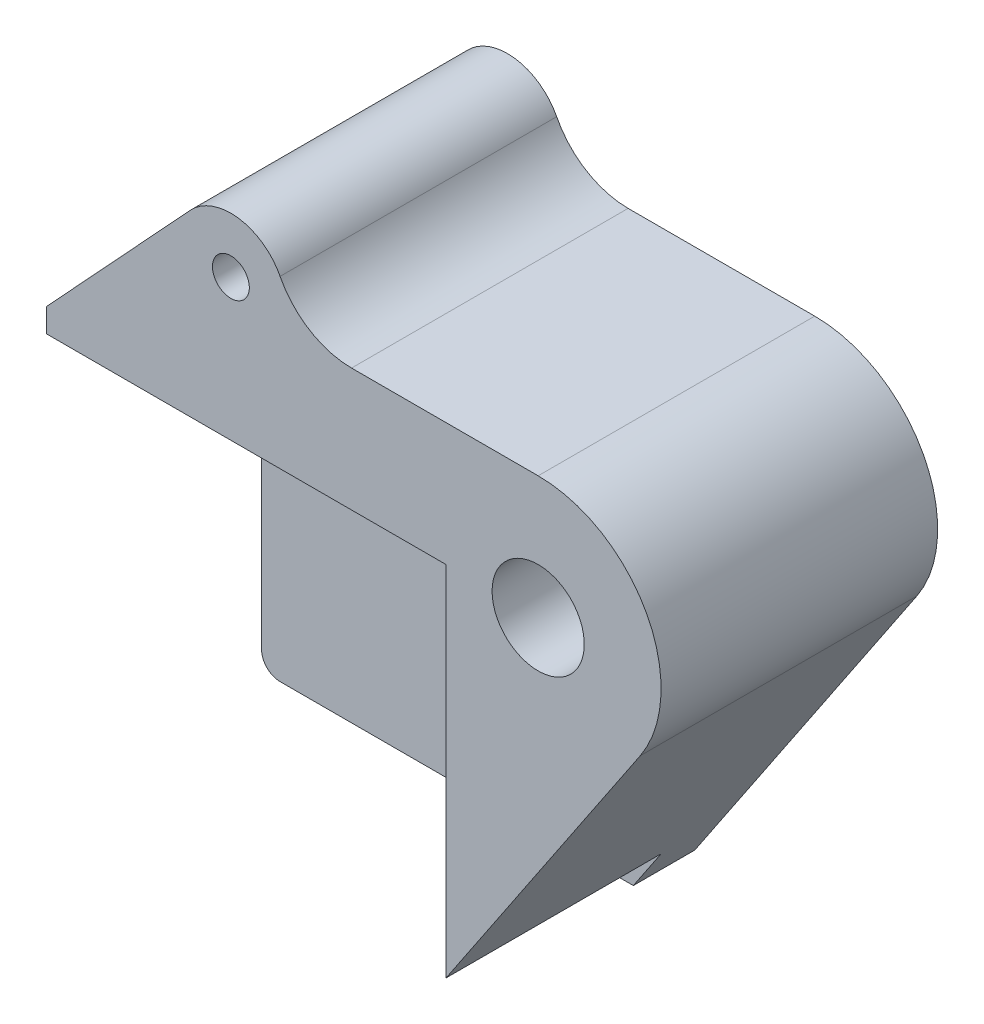
ISO-10303-21;
HEADER;
FILE_DESCRIPTION(('STEP AP214'),'2;1');
FILE_NAME('part.step','',(''),(''),'','','');
FILE_SCHEMA(('AUTOMOTIVE_DESIGN { 1 0 10303 214 1 1 1 1 }'));
ENDSEC;
DATA;
#1=APPLICATION_CONTEXT('core data for automotive mechanical design processes');
#2=APPLICATION_PROTOCOL_DEFINITION('international standard','automotive_design',2000,#1);
#3=PRODUCT_CONTEXT('',#1,'mechanical');
#4=PRODUCT('Part','Part','',(#3));
#5=PRODUCT_RELATED_PRODUCT_CATEGORY('part','',(#4));
#6=PRODUCT_DEFINITION_FORMATION('','',#4);
#7=PRODUCT_DEFINITION_CONTEXT('part definition',#1,'design');
#8=PRODUCT_DEFINITION('design','',#6,#7);
#9=PRODUCT_DEFINITION_SHAPE('','',#8);
#10=(LENGTH_UNIT() NAMED_UNIT(*) SI_UNIT(.MILLI.,.METRE.));
#11=(NAMED_UNIT(*) PLANE_ANGLE_UNIT() SI_UNIT($,.RADIAN.));
#12=(NAMED_UNIT(*) SI_UNIT($,.STERADIAN.) SOLID_ANGLE_UNIT());
#13=UNCERTAINTY_MEASURE_WITH_UNIT(LENGTH_MEASURE(1.E-05),#10,'distance_accuracy_value','');
#14=(GEOMETRIC_REPRESENTATION_CONTEXT(3) GLOBAL_UNCERTAINTY_ASSIGNED_CONTEXT((#13)) GLOBAL_UNIT_ASSIGNED_CONTEXT((#10,
#11,#12)) REPRESENTATION_CONTEXT('',''));
#15=CARTESIAN_POINT('',(0.,0.,0.));
#16=DIRECTION('',(0.,0.,1.));
#17=DIRECTION('',(1.,0.,0.));
#18=AXIS2_PLACEMENT_3D('',#15,#16,#17);
#19=CARTESIAN_POINT('',(0.,0.,45.));
#20=DIRECTION('',(0.,1.,0.));
#21=DIRECTION('',(0.,0.,1.));
#22=AXIS2_PLACEMENT_3D('',#19,#20,#21);
#23=PLANE('',#22);
#24=DIRECTION('',(1.,0.,0.));
#25=VECTOR('',#24,1.);
#26=CARTESIAN_POINT('',(0.,0.,9.99999999999999));
#27=LINE('',#26,#25);
#28=CARTESIAN_POINT('',(3.,0.,9.99999999999999));
#29=VERTEX_POINT('',#28);
#30=CARTESIAN_POINT('',(60.482195672722,0.,9.99999999999999));
#31=VERTEX_POINT('',#30);
#32=EDGE_CURVE('E135',#29,#31,#27,.T.);
#33=ORIENTED_EDGE('',*,*,#32,.F.);
#34=DIRECTION('',(0.,0.,-1.));
#35=VECTOR('',#34,1.);
#36=CARTESIAN_POINT('',(3.,0.,45.));
#37=LINE('',#36,#35);
#38=CARTESIAN_POINT('',(3.,0.,0.));
#39=VERTEX_POINT('',#38);
#40=EDGE_CURVE('E224',#29,#39,#37,.T.);
#41=ORIENTED_EDGE('',*,*,#40,.T.);
#42=DIRECTION('',(1.,0.,0.));
#43=VECTOR('',#42,1.);
#44=CARTESIAN_POINT('',(0.,0.,0.));
#45=LINE('',#44,#43);
#46=CARTESIAN_POINT('',(60.482195672722,0.,0.));
#47=VERTEX_POINT('',#46);
#48=EDGE_CURVE('E173',#39,#47,#45,.T.);
#49=ORIENTED_EDGE('',*,*,#48,.T.);
#50=DIRECTION('',(0.,0.,-1.));
#51=VECTOR('',#50,1.);
#52=CARTESIAN_POINT('',(60.482195672722,0.,45.));
#53=LINE('',#52,#51);
#54=EDGE_CURVE('E186',#31,#47,#53,.T.);
#55=ORIENTED_EDGE('',*,*,#54,.F.);
#56=EDGE_LOOP('',(#33,#41,#49,#55));
#57=FACE_BOUND('',#56,.T.);
#58=ADVANCED_FACE('F37',(#57),#23,.F.);
#59=CARTESIAN_POINT('',(80.,65.,45.));
#60=DIRECTION('',(0.,0.,1.));
#61=DIRECTION('',(1.,0.,0.));
#62=AXIS2_PLACEMENT_3D('',#59,#60,#61);
#63=PLANE('',#62);
#64=DIRECTION('',(-1.,0.,0.));
#65=VECTOR('',#64,1.);
#66=CARTESIAN_POINT('',(0.,65.,45.));
#67=LINE('',#66,#65);
#68=CARTESIAN_POINT('',(65.,65.,45.));
#69=VERTEX_POINT('',#68);
#70=CARTESIAN_POINT('',(0.,65.,45.));
#71=VERTEX_POINT('',#70);
#72=EDGE_CURVE('E152',#69,#71,#67,.T.);
#73=ORIENTED_EDGE('',*,*,#72,.F.);
#74=DIRECTION('',(0.,1.,0.));
#75=VECTOR('',#74,1.);
#76=CARTESIAN_POINT('',(65.,65.,45.));
#77=LINE('',#76,#75);
#78=CARTESIAN_POINT('',(65.,6.73517979818893,45.));
#79=VERTEX_POINT('',#78);
#80=EDGE_CURVE('E141',#79,#69,#77,.T.);
#81=ORIENTED_EDGE('',*,*,#80,.F.);
#82=DIRECTION('',(0.557061214664823,0.830471434256562,0.));
#83=VECTOR('',#82,1.);
#84=CARTESIAN_POINT('',(60.482195672722,0.,45.));
#85=LINE('',#84,#83);
#86=CARTESIAN_POINT('',(96.6094286851312,53.8587757067035,45.));
#87=VERTEX_POINT('',#86);
#88=EDGE_CURVE('E170',#79,#87,#85,.T.);
#89=ORIENTED_EDGE('',*,*,#88,.T.);
#90=CARTESIAN_POINT('',(80.,65.,45.));
#91=DIRECTION('',(0.,0.,1.));
#92=DIRECTION('',(1.,0.,0.));
#93=AXIS2_PLACEMENT_3D('',#90,#91,#92);
#94=CIRCLE('',#93,20.);
#95=CARTESIAN_POINT('',(80.,85.,45.));
#96=VERTEX_POINT('',#95);
#97=EDGE_CURVE('E172',#87,#96,#94,.T.);
#98=ORIENTED_EDGE('',*,*,#97,.T.);
#99=DIRECTION('',(-1.,0.,0.));
#100=VECTOR('',#99,1.);
#101=CARTESIAN_POINT('',(80.,85.,45.));
#102=LINE('',#101,#100);
#103=CARTESIAN_POINT('',(49.6355903017579,85.,45.));
#104=VERTEX_POINT('',#103);
#105=EDGE_CURVE('E175',#96,#104,#102,.T.);
#106=ORIENTED_EDGE('',*,*,#105,.T.);
#107=CARTESIAN_POINT('',(49.6355903017579,98.0648502707704,45.));
#108=DIRECTION('',(0.,0.,-1.));
#109=DIRECTION('',(-1.,0.,0.));
#110=AXIS2_PLACEMENT_3D('',#107,#108,#109);
#111=CIRCLE('',#110,13.0648502707704);
#112=CARTESIAN_POINT('',(38.0091326497658,92.1053372819362,45.));
#113=VERTEX_POINT('',#112);
#114=EDGE_CURVE('E177',#104,#113,#111,.T.);
#115=ORIENTED_EDGE('',*,*,#114,.T.);
#116=CARTESIAN_POINT('',(30.,88.,45.));
#117=DIRECTION('',(0.,0.,1.));
#118=DIRECTION('',(1.,0.,0.));
#119=AXIS2_PLACEMENT_3D('',#116,#117,#118);
#120=CIRCLE('',#119,9.);
#121=CARTESIAN_POINT('',(23.397413697629,94.116032547309,45.));
#122=VERTEX_POINT('',#121);
#123=EDGE_CURVE('E179',#113,#122,#120,.T.);
#124=ORIENTED_EDGE('',*,*,#123,.T.);
#125=DIRECTION('',(-0.679559171923218,-0.733620700263447,0.));
#126=VECTOR('',#125,1.);
#127=CARTESIAN_POINT('',(23.397413697629,94.116032547309,45.));
#128=LINE('',#127,#126);
#129=CARTESIAN_POINT('',(0.,68.8572652016634,45.));
#130=VERTEX_POINT('',#129);
#131=EDGE_CURVE('E181',#122,#130,#128,.T.);
#132=ORIENTED_EDGE('',*,*,#131,.T.);
#133=DIRECTION('',(0.,-1.,0.));
#134=VECTOR('',#133,1.);
#135=CARTESIAN_POINT('',(0.,68.8572652016634,45.));
#136=LINE('',#135,#134);
#137=EDGE_CURVE('E183',#130,#71,#136,.T.);
#138=ORIENTED_EDGE('',*,*,#137,.T.);
#139=EDGE_LOOP('',(#73,#81,#89,#98,#106,#115,#124,#132,#138));
#140=FACE_BOUND('',#139,.T.);
#141=CARTESIAN_POINT('',(30.,88.,45.));
#142=DIRECTION('',(0.,0.,1.));
#143=DIRECTION('',(1.,0.,0.));
#144=AXIS2_PLACEMENT_3D('',#141,#142,#143);
#145=CIRCLE('',#144,3.);
#146=CARTESIAN_POINT('',(27.,88.,45.));
#147=VERTEX_POINT('',#146);
#148=EDGE_CURVE('E164',#147,#147,#145,.T.);
#149=ORIENTED_EDGE('',*,*,#148,.F.);
#150=EDGE_LOOP('',(#149));
#151=FACE_BOUND('',#150,.T.);
#152=CARTESIAN_POINT('',(80.,65.,45.));
#153=DIRECTION('',(0.,0.,1.));
#154=DIRECTION('',(1.,0.,0.));
#155=AXIS2_PLACEMENT_3D('',#152,#153,#154);
#156=CIRCLE('',#155,7.5);
#157=CARTESIAN_POINT('',(72.5,65.,45.));
#158=VERTEX_POINT('',#157);
#159=EDGE_CURVE('E158',#158,#158,#156,.T.);
#160=ORIENTED_EDGE('',*,*,#159,.F.);
#161=EDGE_LOOP('',(#160));
#162=FACE_BOUND('',#161,.T.);
#163=ADVANCED_FACE('F242',(#140,#151,#162),#63,.T.);
#164=CARTESIAN_POINT('',(80.,65.,0.));
#165=DIRECTION('',(0.,0.,1.));
#166=DIRECTION('',(1.,0.,0.));
#167=AXIS2_PLACEMENT_3D('',#164,#165,#166);
#168=PLANE('',#167);
#169=ORIENTED_EDGE('',*,*,#48,.F.);
#170=CARTESIAN_POINT('',(3.,3.,0.));
#171=DIRECTION('',(0.,0.,1.));
#172=DIRECTION('',(1.,0.,0.));
#173=AXIS2_PLACEMENT_3D('',#170,#171,#172);
#174=CIRCLE('',#173,3.);
#175=CARTESIAN_POINT('',(0.,3.,0.));
#176=VERTEX_POINT('',#175);
#177=EDGE_CURVE('E59',#39,#176,#174,.F.);
#178=ORIENTED_EDGE('',*,*,#177,.T.);
#179=DIRECTION('',(0.,-1.,0.));
#180=VECTOR('',#179,1.);
#181=CARTESIAN_POINT('',(0.,68.8572652016634,0.));
#182=LINE('',#181,#180);
#183=CARTESIAN_POINT('',(0.,68.8572652016634,0.));
#184=VERTEX_POINT('',#183);
#185=EDGE_CURVE('E199',#184,#176,#182,.T.);
#186=ORIENTED_EDGE('',*,*,#185,.F.);
#187=DIRECTION('',(-0.679559171923218,-0.733620700263447,0.));
#188=VECTOR('',#187,1.);
#189=CARTESIAN_POINT('',(23.397413697629,94.116032547309,0.));
#190=LINE('',#189,#188);
#191=CARTESIAN_POINT('',(23.397413697629,94.116032547309,0.));
#192=VERTEX_POINT('',#191);
#193=EDGE_CURVE('E197',#192,#184,#190,.T.);
#194=ORIENTED_EDGE('',*,*,#193,.F.);
#195=CARTESIAN_POINT('',(30.,88.,0.));
#196=DIRECTION('',(0.,0.,1.));
#197=DIRECTION('',(1.,0.,0.));
#198=AXIS2_PLACEMENT_3D('',#195,#196,#197);
#199=CIRCLE('',#198,9.);
#200=CARTESIAN_POINT('',(38.0091326497658,92.1053372819362,0.));
#201=VERTEX_POINT('',#200);
#202=EDGE_CURVE('E195',#201,#192,#199,.T.);
#203=ORIENTED_EDGE('',*,*,#202,.F.);
#204=CARTESIAN_POINT('',(49.6355903017579,98.0648502707704,0.));
#205=DIRECTION('',(0.,0.,-1.));
#206=DIRECTION('',(-1.,0.,0.));
#207=AXIS2_PLACEMENT_3D('',#204,#205,#206);
#208=CIRCLE('',#207,13.0648502707704);
#209=CARTESIAN_POINT('',(49.6355903017579,85.,0.));
#210=VERTEX_POINT('',#209);
#211=EDGE_CURVE('E193',#210,#201,#208,.T.);
#212=ORIENTED_EDGE('',*,*,#211,.F.);
#213=DIRECTION('',(-1.,0.,0.));
#214=VECTOR('',#213,1.);
#215=CARTESIAN_POINT('',(80.,85.,0.));
#216=LINE('',#215,#214);
#217=CARTESIAN_POINT('',(80.,85.,0.));
#218=VERTEX_POINT('',#217);
#219=EDGE_CURVE('E191',#218,#210,#216,.T.);
#220=ORIENTED_EDGE('',*,*,#219,.F.);
#221=CARTESIAN_POINT('',(80.,65.,0.));
#222=DIRECTION('',(0.,0.,1.));
#223=DIRECTION('',(1.,0.,0.));
#224=AXIS2_PLACEMENT_3D('',#221,#222,#223);
#225=CIRCLE('',#224,20.);
#226=CARTESIAN_POINT('',(96.6094286851312,53.8587757067035,0.));
#227=VERTEX_POINT('',#226);
#228=EDGE_CURVE('E189',#227,#218,#225,.T.);
#229=ORIENTED_EDGE('',*,*,#228,.F.);
#230=DIRECTION('',(0.557061214664823,0.830471434256562,0.));
#231=VECTOR('',#230,1.);
#232=CARTESIAN_POINT('',(60.482195672722,0.,0.));
#233=LINE('',#232,#231);
#234=EDGE_CURVE('E167',#47,#227,#233,.T.);
#235=ORIENTED_EDGE('',*,*,#234,.F.);
#236=EDGE_LOOP('',(#169,#178,#186,#194,#203,#212,#220,#229,#235));
#237=FACE_BOUND('',#236,.T.);
#238=CARTESIAN_POINT('',(30.,88.,0.));
#239=DIRECTION('',(0.,0.,1.));
#240=DIRECTION('',(1.,0.,0.));
#241=AXIS2_PLACEMENT_3D('',#238,#239,#240);
#242=CIRCLE('',#241,3.);
#243=CARTESIAN_POINT('',(27.,88.,0.));
#244=VERTEX_POINT('',#243);
#245=EDGE_CURVE('E161',#244,#244,#242,.T.);
#246=ORIENTED_EDGE('',*,*,#245,.T.);
#247=EDGE_LOOP('',(#246));
#248=FACE_BOUND('',#247,.T.);
#249=CARTESIAN_POINT('',(80.,65.,0.));
#250=DIRECTION('',(0.,0.,1.));
#251=DIRECTION('',(1.,0.,0.));
#252=AXIS2_PLACEMENT_3D('',#249,#250,#251);
#253=CIRCLE('',#252,7.5);
#254=CARTESIAN_POINT('',(72.5,65.,0.));
#255=VERTEX_POINT('',#254);
#256=EDGE_CURVE('E157',#255,#255,#253,.T.);
#257=ORIENTED_EDGE('',*,*,#256,.T.);
#258=EDGE_LOOP('',(#257));
#259=FACE_BOUND('',#258,.T.);
#260=ADVANCED_FACE('F234',(#237,#248,#259),#168,.F.);
#261=CARTESIAN_POINT('',(60.482195672722,0.,45.));
#262=DIRECTION('',(-0.830471434256562,0.557061214664823,0.));
#263=DIRECTION('',(-0.557061214664823,-0.830471434256562,0.));
#264=AXIS2_PLACEMENT_3D('',#261,#262,#263);
#265=PLANE('',#264);
#266=ORIENTED_EDGE('',*,*,#88,.F.);
#267=DIRECTION('',(0.,0.,-1.));
#268=VECTOR('',#267,1.);
#269=CARTESIAN_POINT('',(65.,6.7351797981889,45.));
#270=LINE('',#269,#268);
#271=CARTESIAN_POINT('',(65.,6.73517979818893,9.99999999999999));
#272=VERTEX_POINT('',#271);
#273=EDGE_CURVE('E222',#79,#272,#270,.T.);
#274=ORIENTED_EDGE('',*,*,#273,.T.);
#275=DIRECTION('',(0.557061214664823,0.830471434256562,0.));
#276=VECTOR('',#275,1.);
#277=CARTESIAN_POINT('',(60.482195672722,0.,9.99999999999999));
#278=LINE('',#277,#276);
#279=EDGE_CURVE('E132',#31,#272,#278,.T.);
#280=ORIENTED_EDGE('',*,*,#279,.F.);
#281=ORIENTED_EDGE('',*,*,#54,.T.);
#282=ORIENTED_EDGE('',*,*,#234,.T.);
#283=DIRECTION('',(0.,0.,-1.));
#284=VECTOR('',#283,1.);
#285=CARTESIAN_POINT('',(96.6094286851312,53.8587757067035,45.));
#286=LINE('',#285,#284);
#287=EDGE_CURVE('E219',#87,#227,#286,.T.);
#288=ORIENTED_EDGE('',*,*,#287,.F.);
#289=EDGE_LOOP('',(#266,#274,#280,#281,#282,#288));
#290=FACE_BOUND('',#289,.T.);
#291=ADVANCED_FACE('F240',(#290),#265,.F.);
#292=CARTESIAN_POINT('',(80.,65.,45.));
#293=DIRECTION('',(0.,0.,-1.));
#294=DIRECTION('',(-1.,0.,0.));
#295=AXIS2_PLACEMENT_3D('',#292,#293,#294);
#296=CYLINDRICAL_SURFACE('',#295,20.);
#297=ORIENTED_EDGE('',*,*,#228,.T.);
#298=DIRECTION('',(0.,0.,-1.));
#299=VECTOR('',#298,1.);
#300=CARTESIAN_POINT('',(80.,85.,45.));
#301=LINE('',#300,#299);
#302=EDGE_CURVE('E216',#96,#218,#301,.T.);
#303=ORIENTED_EDGE('',*,*,#302,.F.);
#304=ORIENTED_EDGE('',*,*,#97,.F.);
#305=ORIENTED_EDGE('',*,*,#287,.T.);
#306=EDGE_LOOP('',(#297,#303,#304,#305));
#307=FACE_BOUND('',#306,.T.);
#308=ADVANCED_FACE('F279',(#307),#296,.T.);
#309=CARTESIAN_POINT('',(80.,85.,45.));
#310=DIRECTION('',(0.,-1.,0.));
#311=DIRECTION('',(0.,0.,-1.));
#312=AXIS2_PLACEMENT_3D('',#309,#310,#311);
#313=PLANE('',#312);
#314=ORIENTED_EDGE('',*,*,#219,.T.);
#315=DIRECTION('',(0.,0.,-1.));
#316=VECTOR('',#315,1.);
#317=CARTESIAN_POINT('',(49.6355903017579,85.,45.));
#318=LINE('',#317,#316);
#319=EDGE_CURVE('E213',#104,#210,#318,.T.);
#320=ORIENTED_EDGE('',*,*,#319,.F.);
#321=ORIENTED_EDGE('',*,*,#105,.F.);
#322=ORIENTED_EDGE('',*,*,#302,.T.);
#323=EDGE_LOOP('',(#314,#320,#321,#322));
#324=FACE_BOUND('',#323,.T.);
#325=ADVANCED_FACE('F275',(#324),#313,.F.);
#326=CARTESIAN_POINT('',(49.6355903017579,98.0648502707704,45.));
#327=DIRECTION('',(0.,0.,-1.));
#328=DIRECTION('',(-1.,0.,0.));
#329=AXIS2_PLACEMENT_3D('',#326,#327,#328);
#330=CYLINDRICAL_SURFACE('',#329,13.0648502707704);
#331=ORIENTED_EDGE('',*,*,#211,.T.);
#332=DIRECTION('',(0.,0.,-1.));
#333=VECTOR('',#332,1.);
#334=CARTESIAN_POINT('',(38.0091326497658,92.1053372819362,45.));
#335=LINE('',#334,#333);
#336=EDGE_CURVE('E210',#113,#201,#335,.T.);
#337=ORIENTED_EDGE('',*,*,#336,.F.);
#338=ORIENTED_EDGE('',*,*,#114,.F.);
#339=ORIENTED_EDGE('',*,*,#319,.T.);
#340=EDGE_LOOP('',(#331,#337,#338,#339));
#341=FACE_BOUND('',#340,.T.);
#342=ADVANCED_FACE('F271',(#341),#330,.F.);
#343=CARTESIAN_POINT('',(30.,88.,45.));
#344=DIRECTION('',(0.,0.,-1.));
#345=DIRECTION('',(-1.,0.,0.));
#346=AXIS2_PLACEMENT_3D('',#343,#344,#345);
#347=CYLINDRICAL_SURFACE('',#346,9.);
#348=ORIENTED_EDGE('',*,*,#202,.T.);
#349=DIRECTION('',(0.,0.,-1.));
#350=VECTOR('',#349,1.);
#351=CARTESIAN_POINT('',(23.397413697629,94.116032547309,45.));
#352=LINE('',#351,#350);
#353=EDGE_CURVE('E207',#122,#192,#352,.T.);
#354=ORIENTED_EDGE('',*,*,#353,.F.);
#355=ORIENTED_EDGE('',*,*,#123,.F.);
#356=ORIENTED_EDGE('',*,*,#336,.T.);
#357=EDGE_LOOP('',(#348,#354,#355,#356));
#358=FACE_BOUND('',#357,.T.);
#359=ADVANCED_FACE('F267',(#358),#347,.T.);
#360=CARTESIAN_POINT('',(23.397413697629,94.116032547309,45.));
#361=DIRECTION('',(0.733620700263447,-0.679559171923218,0.));
#362=DIRECTION('',(0.679559171923218,0.733620700263447,0.));
#363=AXIS2_PLACEMENT_3D('',#360,#361,#362);
#364=PLANE('',#363);
#365=ORIENTED_EDGE('',*,*,#193,.T.);
#366=DIRECTION('',(0.,0.,-1.));
#367=VECTOR('',#366,1.);
#368=CARTESIAN_POINT('',(0.,68.8572652016634,45.));
#369=LINE('',#368,#367);
#370=EDGE_CURVE('E204',#130,#184,#369,.T.);
#371=ORIENTED_EDGE('',*,*,#370,.F.);
#372=ORIENTED_EDGE('',*,*,#131,.F.);
#373=ORIENTED_EDGE('',*,*,#353,.T.);
#374=EDGE_LOOP('',(#365,#371,#372,#373));
#375=FACE_BOUND('',#374,.T.);
#376=ADVANCED_FACE('F264',(#375),#364,.F.);
#377=CARTESIAN_POINT('',(0.,68.8572652016634,45.));
#378=DIRECTION('',(1.,0.,0.));
#379=DIRECTION('',(0.,0.,-1.));
#380=AXIS2_PLACEMENT_3D('',#377,#378,#379);
#381=PLANE('',#380);
#382=ORIENTED_EDGE('',*,*,#185,.T.);
#383=DIRECTION('',(0.,0.,-1.));
#384=VECTOR('',#383,1.);
#385=CARTESIAN_POINT('',(0.,3.,45.));
#386=LINE('',#385,#384);
#387=CARTESIAN_POINT('',(0.,3.,9.99999999999999));
#388=VERTEX_POINT('',#387);
#389=EDGE_CURVE('E45',#176,#388,#386,.F.);
#390=ORIENTED_EDGE('',*,*,#389,.T.);
#391=DIRECTION('',(0.,-1.,0.));
#392=VECTOR('',#391,1.);
#393=CARTESIAN_POINT('',(0.,65.,9.99999999999999));
#394=LINE('',#393,#392);
#395=CARTESIAN_POINT('',(0.,65.,9.99999999999999));
#396=VERTEX_POINT('',#395);
#397=EDGE_CURVE('E154',#396,#388,#394,.T.);
#398=ORIENTED_EDGE('',*,*,#397,.F.);
#399=DIRECTION('',(0.,0.,1.));
#400=VECTOR('',#399,1.);
#401=CARTESIAN_POINT('',(0.,65.,9.99999999999999));
#402=LINE('',#401,#400);
#403=EDGE_CURVE('E144',#396,#71,#402,.T.);
#404=ORIENTED_EDGE('',*,*,#403,.T.);
#405=ORIENTED_EDGE('',*,*,#137,.F.);
#406=ORIENTED_EDGE('',*,*,#370,.T.);
#407=EDGE_LOOP('',(#382,#390,#398,#404,#405,#406));
#408=FACE_BOUND('',#407,.T.);
#409=ADVANCED_FACE('F246',(#408),#381,.F.);
#410=CARTESIAN_POINT('',(30.,88.,45.));
#411=DIRECTION('',(0.,0.,-1.));
#412=DIRECTION('',(-1.,0.,0.));
#413=AXIS2_PLACEMENT_3D('',#410,#411,#412);
#414=CYLINDRICAL_SURFACE('',#413,3.);
#415=CARTESIAN_POINT('',(27.,88.,45.));
#416=CARTESIAN_POINT('',(27.,88.,44.53125));
#417=CARTESIAN_POINT('',(27.,88.,44.0625));
#418=CARTESIAN_POINT('',(27.,88.,43.125));
#419=CARTESIAN_POINT('',(27.,88.,42.65625));
#420=CARTESIAN_POINT('',(27.,88.,41.71875));
#421=CARTESIAN_POINT('',(27.,88.,41.25));
#422=CARTESIAN_POINT('',(27.,88.,40.3125));
#423=CARTESIAN_POINT('',(27.,88.,39.84375));
#424=CARTESIAN_POINT('',(27.,88.,38.90625));
#425=CARTESIAN_POINT('',(27.,88.,38.4375));
#426=CARTESIAN_POINT('',(27.,88.,37.5));
#427=CARTESIAN_POINT('',(27.,88.,37.03125));
#428=CARTESIAN_POINT('',(27.,88.,36.09375));
#429=CARTESIAN_POINT('',(27.,88.,35.625));
#430=CARTESIAN_POINT('',(27.,88.,34.6875));
#431=CARTESIAN_POINT('',(27.,88.,34.21875));
#432=CARTESIAN_POINT('',(27.,88.,33.28125));
#433=CARTESIAN_POINT('',(27.,88.,32.8125));
#434=CARTESIAN_POINT('',(27.,88.,31.875));
#435=CARTESIAN_POINT('',(27.,88.,31.40625));
#436=CARTESIAN_POINT('',(27.,88.,30.46875));
#437=CARTESIAN_POINT('',(27.,88.,30.));
#438=CARTESIAN_POINT('',(27.,88.,29.0625));
#439=CARTESIAN_POINT('',(27.,88.,28.59375));
#440=CARTESIAN_POINT('',(27.,88.,27.65625));
#441=CARTESIAN_POINT('',(27.,88.,27.1875));
#442=CARTESIAN_POINT('',(27.,88.,26.25));
#443=CARTESIAN_POINT('',(27.,88.,25.78125));
#444=CARTESIAN_POINT('',(27.,88.,24.84375));
#445=CARTESIAN_POINT('',(27.,88.,24.375));
#446=CARTESIAN_POINT('',(27.,88.,23.4375));
#447=CARTESIAN_POINT('',(27.,88.,22.96875));
#448=CARTESIAN_POINT('',(27.,88.,22.03125));
#449=CARTESIAN_POINT('',(27.,88.,21.5625));
#450=CARTESIAN_POINT('',(27.,88.,20.625));
#451=CARTESIAN_POINT('',(27.,88.,20.15625));
#452=CARTESIAN_POINT('',(27.,88.,19.21875));
#453=CARTESIAN_POINT('',(27.,88.,18.75));
#454=CARTESIAN_POINT('',(27.,88.,17.8125));
#455=CARTESIAN_POINT('',(27.,88.,17.34375));
#456=CARTESIAN_POINT('',(27.,88.,16.40625));
#457=CARTESIAN_POINT('',(27.,88.,15.9375));
#458=CARTESIAN_POINT('',(27.,88.,15.));
#459=CARTESIAN_POINT('',(27.,88.,14.53125));
#460=CARTESIAN_POINT('',(27.,88.,13.59375));
#461=CARTESIAN_POINT('',(27.,88.,13.125));
#462=CARTESIAN_POINT('',(27.,88.,12.1875));
#463=CARTESIAN_POINT('',(27.,88.,11.71875));
#464=CARTESIAN_POINT('',(27.,88.,10.78125));
#465=CARTESIAN_POINT('',(27.,88.,10.3125));
#466=CARTESIAN_POINT('',(27.,88.,9.375));
#467=CARTESIAN_POINT('',(27.,88.,8.90625));
#468=CARTESIAN_POINT('',(27.,88.,7.96874999999999));
#469=CARTESIAN_POINT('',(27.,88.,7.5));
#470=CARTESIAN_POINT('',(27.,88.,6.5625));
#471=CARTESIAN_POINT('',(27.,88.,6.09375));
#472=CARTESIAN_POINT('',(27.,88.,5.15625));
#473=CARTESIAN_POINT('',(27.,88.,4.68749999999999));
#474=CARTESIAN_POINT('',(27.,88.,3.74999999999999));
#475=CARTESIAN_POINT('',(27.,88.,3.28124999999999));
#476=CARTESIAN_POINT('',(27.,88.,2.34374999999999));
#477=CARTESIAN_POINT('',(27.,88.,1.87499999999999));
#478=CARTESIAN_POINT('',(27.,88.,0.937499999999992));
#479=CARTESIAN_POINT('',(27.,88.,0.468749999999993));
#480=CARTESIAN_POINT('',(27.,88.,0.));
#481=B_SPLINE_CURVE_WITH_KNOTS('',3,(#415,#416,#417,#418,#419,#420,#421,#422,#423,#424,#425,
#426,#427,#428,#429,#430,#431,#432,#433,#434,#435,#436,#437,#438,#439,#440,#441,#442,#443,#444,
#445,#446,#447,#448,#449,#450,#451,#452,#453,#454,#455,#456,#457,#458,#459,#460,#461,#462,#463,
#464,#465,#466,#467,#468,#469,#470,#471,#472,#473,#474,#475,#476,#477,#478,#479,#480),
.UNSPECIFIED.,.F.,.F.,(4,2,2,2,2,2,2,2,2,2,2,2,2,2,2,2,2,2,2,2,2,2,2,2,2,2,2,2,2,2,2,2,4),(0.,
1.40625,2.8125,4.21875000000001,5.62500000000001,7.03125,8.4375,9.84375000000001,11.25,12.65625,
14.0625,15.46875,16.875,18.28125,19.6875,21.09375,22.5,23.90625,25.3125,26.71875,28.125,
29.53125,30.9375,32.34375,33.75,35.15625,36.5625,37.96875,39.375,40.78125,42.1875,43.59375,45.),.UNSPECIFIED.);
#482=EDGE_CURVE('BSEAM263',#147,#244,#481,.T.);
#483=ORIENTED_EDGE('',*,*,#148,.T.);
#484=ORIENTED_EDGE('',*,*,#245,.F.);
#485=ORIENTED_EDGE('',*,*,#482,.T.);
#486=ORIENTED_EDGE('',*,*,#482,.F.);
#487=EDGE_LOOP('',(#483,#485,#484,#486));
#488=FACE_BOUND('',#487,.T.);
#489=ADVANCED_FACE('F263',(#488),#414,.F.);
#490=CARTESIAN_POINT('',(80.,65.,45.));
#491=DIRECTION('',(0.,0.,-1.));
#492=DIRECTION('',(-1.,0.,0.));
#493=AXIS2_PLACEMENT_3D('',#490,#491,#492);
#494=CYLINDRICAL_SURFACE('',#493,7.5);
#495=CARTESIAN_POINT('',(72.5,65.,45.));
#496=CARTESIAN_POINT('',(72.5,65.,44.53125));
#497=CARTESIAN_POINT('',(72.5,65.,44.0625));
#498=CARTESIAN_POINT('',(72.5,65.,43.125));
#499=CARTESIAN_POINT('',(72.5,65.,42.65625));
#500=CARTESIAN_POINT('',(72.5,65.,41.71875));
#501=CARTESIAN_POINT('',(72.5,65.,41.25));
#502=CARTESIAN_POINT('',(72.5,65.,40.3125));
#503=CARTESIAN_POINT('',(72.5,65.,39.84375));
#504=CARTESIAN_POINT('',(72.5,65.,38.90625));
#505=CARTESIAN_POINT('',(72.5,65.,38.4375));
#506=CARTESIAN_POINT('',(72.5,65.,37.5));
#507=CARTESIAN_POINT('',(72.5,65.,37.03125));
#508=CARTESIAN_POINT('',(72.5,65.,36.09375));
#509=CARTESIAN_POINT('',(72.5,65.,35.625));
#510=CARTESIAN_POINT('',(72.5,65.,34.6875));
#511=CARTESIAN_POINT('',(72.5,65.,34.21875));
#512=CARTESIAN_POINT('',(72.5,65.,33.28125));
#513=CARTESIAN_POINT('',(72.5,65.,32.8125));
#514=CARTESIAN_POINT('',(72.5,65.,31.875));
#515=CARTESIAN_POINT('',(72.5,65.,31.40625));
#516=CARTESIAN_POINT('',(72.5,65.,30.46875));
#517=CARTESIAN_POINT('',(72.5,65.,30.));
#518=CARTESIAN_POINT('',(72.5,65.,29.0625));
#519=CARTESIAN_POINT('',(72.5,65.,28.59375));
#520=CARTESIAN_POINT('',(72.5,65.,27.65625));
#521=CARTESIAN_POINT('',(72.5,65.,27.1875));
#522=CARTESIAN_POINT('',(72.5,65.,26.25));
#523=CARTESIAN_POINT('',(72.5,65.,25.78125));
#524=CARTESIAN_POINT('',(72.5,65.,24.84375));
#525=CARTESIAN_POINT('',(72.5,65.,24.375));
#526=CARTESIAN_POINT('',(72.5,65.,23.4375));
#527=CARTESIAN_POINT('',(72.5,65.,22.96875));
#528=CARTESIAN_POINT('',(72.5,65.,22.03125));
#529=CARTESIAN_POINT('',(72.5,65.,21.5625));
#530=CARTESIAN_POINT('',(72.5,65.,20.625));
#531=CARTESIAN_POINT('',(72.5,65.,20.15625));
#532=CARTESIAN_POINT('',(72.5,65.,19.21875));
#533=CARTESIAN_POINT('',(72.5,65.,18.75));
#534=CARTESIAN_POINT('',(72.5,65.,17.8125));
#535=CARTESIAN_POINT('',(72.5,65.,17.34375));
#536=CARTESIAN_POINT('',(72.5,65.,16.40625));
#537=CARTESIAN_POINT('',(72.5,65.,15.9375));
#538=CARTESIAN_POINT('',(72.5,65.,15.));
#539=CARTESIAN_POINT('',(72.5,65.,14.53125));
#540=CARTESIAN_POINT('',(72.5,65.,13.59375));
#541=CARTESIAN_POINT('',(72.5,65.,13.125));
#542=CARTESIAN_POINT('',(72.5,65.,12.1875));
#543=CARTESIAN_POINT('',(72.5,65.,11.71875));
#544=CARTESIAN_POINT('',(72.5,65.,10.78125));
#545=CARTESIAN_POINT('',(72.5,65.,10.3125));
#546=CARTESIAN_POINT('',(72.5,65.,9.37499999999999));
#547=CARTESIAN_POINT('',(72.5,65.,8.90624999999999));
#548=CARTESIAN_POINT('',(72.5,65.,7.96874999999999));
#549=CARTESIAN_POINT('',(72.5,65.,7.5));
#550=CARTESIAN_POINT('',(72.5,65.,6.56249999999999));
#551=CARTESIAN_POINT('',(72.5,65.,6.09374999999999));
#552=CARTESIAN_POINT('',(72.5,65.,5.15624999999999));
#553=CARTESIAN_POINT('',(72.5,65.,4.68749999999999));
#554=CARTESIAN_POINT('',(72.5,65.,3.74999999999999));
#555=CARTESIAN_POINT('',(72.5,65.,3.28124999999999));
#556=CARTESIAN_POINT('',(72.5,65.,2.34374999999999));
#557=CARTESIAN_POINT('',(72.5,65.,1.87499999999999));
#558=CARTESIAN_POINT('',(72.5,65.,0.937499999999992));
#559=CARTESIAN_POINT('',(72.5,65.,0.468749999999993));
#560=CARTESIAN_POINT('',(72.5,65.,0.));
#561=B_SPLINE_CURVE_WITH_KNOTS('',3,(#495,#496,#497,#498,#499,#500,#501,#502,#503,#504,#505,
#506,#507,#508,#509,#510,#511,#512,#513,#514,#515,#516,#517,#518,#519,#520,#521,#522,#523,#524,
#525,#526,#527,#528,#529,#530,#531,#532,#533,#534,#535,#536,#537,#538,#539,#540,#541,#542,#543,
#544,#545,#546,#547,#548,#549,#550,#551,#552,#553,#554,#555,#556,#557,#558,#559,#560),
.UNSPECIFIED.,.F.,.F.,(4,2,2,2,2,2,2,2,2,2,2,2,2,2,2,2,2,2,2,2,2,2,2,2,2,2,2,2,2,2,2,2,4),(0.,
1.40625,2.8125,4.21874999999999,5.625,7.03125,8.43749999999999,9.84375,11.25,12.65625,14.0625,
15.46875,16.875,18.28125,19.6875,21.09375,22.5,23.90625,25.3125,26.71875,28.125,29.53125,
30.9375,32.34375,33.75,35.15625,36.5625,37.96875,39.375,40.78125,42.1875,43.59375,45.),.UNSPECIFIED.);
#562=EDGE_CURVE('BSEAM300',#158,#255,#561,.T.);
#563=ORIENTED_EDGE('',*,*,#159,.T.);
#564=ORIENTED_EDGE('',*,*,#256,.F.);
#565=ORIENTED_EDGE('',*,*,#562,.T.);
#566=ORIENTED_EDGE('',*,*,#562,.F.);
#567=EDGE_LOOP('',(#563,#565,#564,#566));
#568=FACE_BOUND('',#567,.T.);
#569=ADVANCED_FACE('F300',(#568),#494,.F.);
#570=CARTESIAN_POINT('',(65.,65.,9.99999999999999));
#571=DIRECTION('',(1.,0.,0.));
#572=DIRECTION('',(0.,1.,0.));
#573=AXIS2_PLACEMENT_3D('',#570,#571,#572);
#574=PLANE('',#573);
#575=ORIENTED_EDGE('',*,*,#80,.T.);
#576=DIRECTION('',(0.,0.,1.));
#577=VECTOR('',#576,1.);
#578=CARTESIAN_POINT('',(65.,65.,9.99999999999999));
#579=LINE('',#578,#577);
#580=CARTESIAN_POINT('',(65.,65.,9.99999999999999));
#581=VERTEX_POINT('',#580);
#582=EDGE_CURVE('E138',#581,#69,#579,.T.);
#583=ORIENTED_EDGE('',*,*,#582,.F.);
#584=DIRECTION('',(0.,1.,0.));
#585=VECTOR('',#584,1.);
#586=CARTESIAN_POINT('',(65.,65.,9.99999999999999));
#587=LINE('',#586,#585);
#588=EDGE_CURVE('E126',#272,#581,#587,.T.);
#589=ORIENTED_EDGE('',*,*,#588,.F.);
#590=ORIENTED_EDGE('',*,*,#273,.F.);
#591=EDGE_LOOP('',(#575,#583,#589,#590));
#592=FACE_BOUND('',#591,.T.);
#593=ADVANCED_FACE('F139',(#592),#574,.F.);
#594=CARTESIAN_POINT('',(0.,0.,9.99999999999999));
#595=DIRECTION('',(0.,0.,1.));
#596=DIRECTION('',(1.,0.,0.));
#597=AXIS2_PLACEMENT_3D('',#594,#595,#596);
#598=PLANE('',#597);
#599=ORIENTED_EDGE('',*,*,#397,.T.);
#600=CARTESIAN_POINT('',(3.,3.,9.99999999999999));
#601=DIRECTION('',(0.,0.,1.));
#602=DIRECTION('',(1.,0.,0.));
#603=AXIS2_PLACEMENT_3D('',#600,#601,#602);
#604=CIRCLE('',#603,3.);
#605=EDGE_CURVE('E11',#388,#29,#604,.T.);
#606=ORIENTED_EDGE('',*,*,#605,.T.);
#607=ORIENTED_EDGE('',*,*,#32,.T.);
#608=ORIENTED_EDGE('',*,*,#279,.T.);
#609=ORIENTED_EDGE('',*,*,#588,.T.);
#610=DIRECTION('',(-1.,0.,0.));
#611=VECTOR('',#610,1.);
#612=CARTESIAN_POINT('',(0.,65.,9.99999999999999));
#613=LINE('',#612,#611);
#614=EDGE_CURVE('E130',#581,#396,#613,.T.);
#615=ORIENTED_EDGE('',*,*,#614,.T.);
#616=EDGE_LOOP('',(#599,#606,#607,#608,#609,#615));
#617=FACE_BOUND('',#616,.T.);
#618=ADVANCED_FACE('F128',(#617),#598,.T.);
#619=CARTESIAN_POINT('',(0.,65.,9.99999999999999));
#620=DIRECTION('',(0.,1.,0.));
#621=DIRECTION('',(0.,0.,1.));
#622=AXIS2_PLACEMENT_3D('',#619,#620,#621);
#623=PLANE('',#622);
#624=ORIENTED_EDGE('',*,*,#72,.T.);
#625=ORIENTED_EDGE('',*,*,#403,.F.);
#626=ORIENTED_EDGE('',*,*,#614,.F.);
#627=ORIENTED_EDGE('',*,*,#582,.T.);
#628=EDGE_LOOP('',(#624,#625,#626,#627));
#629=FACE_BOUND('',#628,.T.);
#630=ADVANCED_FACE('F146',(#629),#623,.F.);
#631=CARTESIAN_POINT('',(3.,3.,45.));
#632=DIRECTION('',(0.,0.,-1.));
#633=DIRECTION('',(-1.,0.,0.));
#634=AXIS2_PLACEMENT_3D('',#631,#632,#633);
#635=CYLINDRICAL_SURFACE('',#634,3.);
#636=ORIENTED_EDGE('',*,*,#605,.F.);
#637=ORIENTED_EDGE('',*,*,#389,.F.);
#638=ORIENTED_EDGE('',*,*,#177,.F.);
#639=ORIENTED_EDGE('',*,*,#40,.F.);
#640=EDGE_LOOP('',(#636,#637,#638,#639));
#641=FACE_BOUND('',#640,.T.);
#642=ADVANCED_FACE('F39',(#641),#635,.T.);
#643=CLOSED_SHELL('',(#58,#163,#260,#291,#308,#325,#342,#359,#376,#409,#489,#569,#593,#618,#630,#642));
#644=MANIFOLD_SOLID_BREP('B2',#643);
#645=ADVANCED_BREP_SHAPE_REPRESENTATION('',(#18,#644),#14);
#646=SHAPE_DEFINITION_REPRESENTATION(#9,#645);
ENDSEC;
END-ISO-10303-21;
